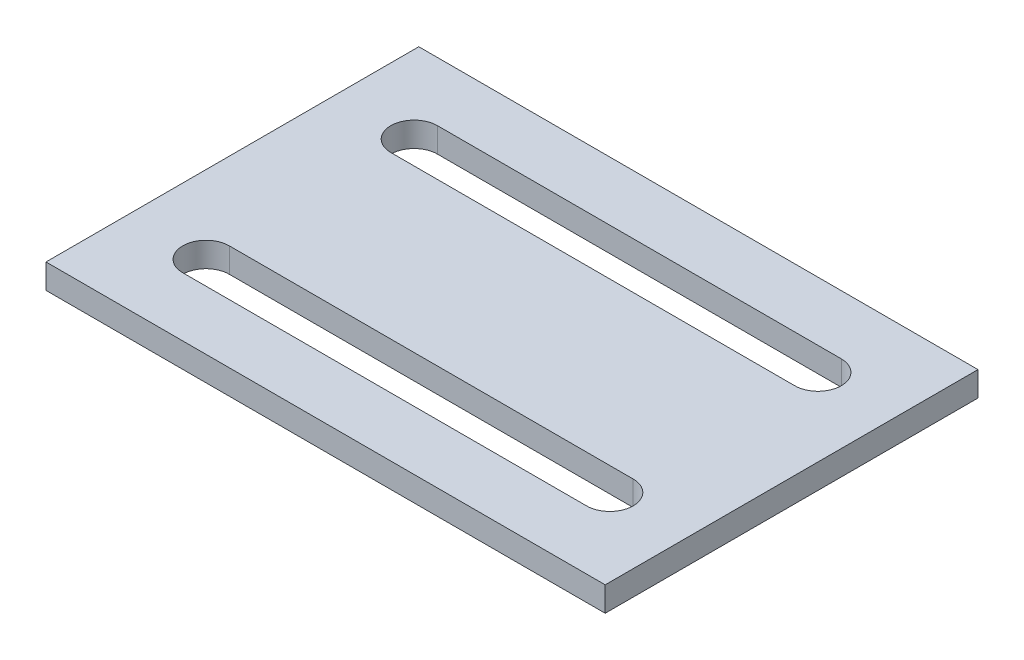
ISO-10303-21;
HEADER;
FILE_DESCRIPTION(('STEP AP214'),'2;1');
FILE_NAME('part.step','',(''),(''),'','','');
FILE_SCHEMA(('AUTOMOTIVE_DESIGN { 1 0 10303 214 1 1 1 1 }'));
ENDSEC;
DATA;
#1=APPLICATION_CONTEXT('core data for automotive mechanical design processes');
#2=APPLICATION_PROTOCOL_DEFINITION('international standard','automotive_design',2000,#1);
#3=PRODUCT_CONTEXT('',#1,'mechanical');
#4=PRODUCT('Part','Part','',(#3));
#5=PRODUCT_RELATED_PRODUCT_CATEGORY('part','',(#4));
#6=PRODUCT_DEFINITION_FORMATION('','',#4);
#7=PRODUCT_DEFINITION_CONTEXT('part definition',#1,'design');
#8=PRODUCT_DEFINITION('design','',#6,#7);
#9=PRODUCT_DEFINITION_SHAPE('','',#8);
#10=(LENGTH_UNIT() NAMED_UNIT(*) SI_UNIT(.MILLI.,.METRE.));
#11=(NAMED_UNIT(*) PLANE_ANGLE_UNIT() SI_UNIT($,.RADIAN.));
#12=(NAMED_UNIT(*) SI_UNIT($,.STERADIAN.) SOLID_ANGLE_UNIT());
#13=UNCERTAINTY_MEASURE_WITH_UNIT(LENGTH_MEASURE(1.E-05),#10,'distance_accuracy_value','');
#14=(GEOMETRIC_REPRESENTATION_CONTEXT(3) GLOBAL_UNCERTAINTY_ASSIGNED_CONTEXT((#13)) GLOBAL_UNIT_ASSIGNED_CONTEXT((#10,
#11,#12)) REPRESENTATION_CONTEXT('',''));
#15=CARTESIAN_POINT('',(0.,0.,0.));
#16=DIRECTION('',(0.,0.,1.));
#17=DIRECTION('',(1.,0.,0.));
#18=AXIS2_PLACEMENT_3D('',#15,#16,#17);
#19=CARTESIAN_POINT('',(0.,7.9375,0.));
#20=DIRECTION('',(0.,1.,0.));
#21=DIRECTION('',(0.,0.,1.));
#22=AXIS2_PLACEMENT_3D('',#19,#20,#21);
#23=PLANE('',#22);
#24=DIRECTION('',(0.,0.,1.));
#25=VECTOR('',#24,1.);
#26=CARTESIAN_POINT('',(-90.,7.9375,60.));
#27=LINE('',#26,#25);
#28=CARTESIAN_POINT('',(-90.,7.9375,-60.));
#29=VERTEX_POINT('',#28);
#30=CARTESIAN_POINT('',(-90.,7.9375,60.));
#31=VERTEX_POINT('',#30);
#32=EDGE_CURVE('E189',#29,#31,#27,.T.);
#33=ORIENTED_EDGE('',*,*,#32,.T.);
#34=DIRECTION('',(1.,0.,0.));
#35=VECTOR('',#34,1.);
#36=CARTESIAN_POINT('',(90.,7.9375,60.));
#37=LINE('',#36,#35);
#38=CARTESIAN_POINT('',(90.,7.9375,60.));
#39=VERTEX_POINT('',#38);
#40=EDGE_CURVE('E192',#31,#39,#37,.T.);
#41=ORIENTED_EDGE('',*,*,#40,.T.);
#42=DIRECTION('',(0.,0.,-1.));
#43=VECTOR('',#42,1.);
#44=CARTESIAN_POINT('',(90.,7.9375,60.));
#45=LINE('',#44,#43);
#46=CARTESIAN_POINT('',(90.,7.9375,-60.));
#47=VERTEX_POINT('',#46);
#48=EDGE_CURVE('E195',#39,#47,#45,.T.);
#49=ORIENTED_EDGE('',*,*,#48,.T.);
#50=DIRECTION('',(-1.,0.,0.));
#51=VECTOR('',#50,1.);
#52=CARTESIAN_POINT('',(90.,7.9375,-60.));
#53=LINE('',#52,#51);
#54=EDGE_CURVE('E197',#47,#29,#53,.T.);
#55=ORIENTED_EDGE('',*,*,#54,.T.);
#56=EDGE_LOOP('',(#33,#41,#49,#55));
#57=FACE_BOUND('',#56,.T.);
#58=DIRECTION('',(1.,0.,0.));
#59=VECTOR('',#58,1.);
#60=CARTESIAN_POINT('',(-65.,7.9375,41.));
#61=LINE('',#60,#59);
#62=CARTESIAN_POINT('',(-65.,7.9375,41.));
#63=VERTEX_POINT('',#62);
#64=CARTESIAN_POINT('',(65.,7.9375,41.));
#65=VERTEX_POINT('',#64);
#66=EDGE_CURVE('E160',#63,#65,#61,.T.);
#67=ORIENTED_EDGE('',*,*,#66,.F.);
#68=CARTESIAN_POINT('',(-65.,7.9375,33.5));
#69=DIRECTION('',(0.,1.,0.));
#70=DIRECTION('',(0.,0.,1.));
#71=AXIS2_PLACEMENT_3D('',#68,#69,#70);
#72=CIRCLE('',#71,7.5);
#73=CARTESIAN_POINT('',(-65.,7.9375,26.));
#74=VERTEX_POINT('',#73);
#75=EDGE_CURVE('E158',#74,#63,#72,.T.);
#76=ORIENTED_EDGE('',*,*,#75,.F.);
#77=DIRECTION('',(-1.,0.,0.));
#78=VECTOR('',#77,1.);
#79=CARTESIAN_POINT('',(-65.,7.9375,26.));
#80=LINE('',#79,#78);
#81=CARTESIAN_POINT('',(65.,7.9375,26.));
#82=VERTEX_POINT('',#81);
#83=EDGE_CURVE('E166',#82,#74,#80,.T.);
#84=ORIENTED_EDGE('',*,*,#83,.F.);
#85=CARTESIAN_POINT('',(65.,7.9375,33.5));
#86=DIRECTION('',(0.,1.,0.));
#87=DIRECTION('',(0.,0.,1.));
#88=AXIS2_PLACEMENT_3D('',#85,#86,#87);
#89=CIRCLE('',#88,7.5);
#90=EDGE_CURVE('E163',#65,#82,#89,.T.);
#91=ORIENTED_EDGE('',*,*,#90,.F.);
#92=EDGE_LOOP('',(#67,#76,#84,#91));
#93=FACE_BOUND('',#92,.T.);
#94=DIRECTION('',(1.,0.,0.));
#95=VECTOR('',#94,1.);
#96=CARTESIAN_POINT('',(-65.,7.9375,-26.));
#97=LINE('',#96,#95);
#98=CARTESIAN_POINT('',(-65.,7.9375,-26.));
#99=VERTEX_POINT('',#98);
#100=CARTESIAN_POINT('',(65.,7.9375,-26.));
#101=VERTEX_POINT('',#100);
#102=EDGE_CURVE('E130',#99,#101,#97,.T.);
#103=ORIENTED_EDGE('',*,*,#102,.F.);
#104=CARTESIAN_POINT('',(-65.,7.9375,-33.5));
#105=DIRECTION('',(0.,1.,0.));
#106=DIRECTION('',(0.,0.,1.));
#107=AXIS2_PLACEMENT_3D('',#104,#105,#106);
#108=CIRCLE('',#107,7.50000000000001);
#109=CARTESIAN_POINT('',(-65.,7.9375,-41.));
#110=VERTEX_POINT('',#109);
#111=EDGE_CURVE('E122',#110,#99,#108,.T.);
#112=ORIENTED_EDGE('',*,*,#111,.F.);
#113=DIRECTION('',(-1.,0.,0.));
#114=VECTOR('',#113,1.);
#115=CARTESIAN_POINT('',(-65.,7.9375,-41.));
#116=LINE('',#115,#114);
#117=CARTESIAN_POINT('',(65.,7.9375,-41.));
#118=VERTEX_POINT('',#117);
#119=EDGE_CURVE('E144',#118,#110,#116,.T.);
#120=ORIENTED_EDGE('',*,*,#119,.F.);
#121=CARTESIAN_POINT('',(65.,7.9375,-33.5));
#122=DIRECTION('',(0.,1.,0.));
#123=DIRECTION('',(0.,0.,1.));
#124=AXIS2_PLACEMENT_3D('',#121,#122,#123);
#125=CIRCLE('',#124,7.50000000000001);
#126=EDGE_CURVE('E142',#101,#118,#125,.T.);
#127=ORIENTED_EDGE('',*,*,#126,.F.);
#128=EDGE_LOOP('',(#103,#112,#120,#127));
#129=FACE_BOUND('',#128,.T.);
#130=ADVANCED_FACE('F33',(#57,#93,#129),#23,.T.);
#131=CARTESIAN_POINT('',(0.,0.,0.));
#132=DIRECTION('',(0.,1.,0.));
#133=DIRECTION('',(0.,0.,1.));
#134=AXIS2_PLACEMENT_3D('',#131,#132,#133);
#135=PLANE('',#134);
#136=CARTESIAN_POINT('',(-65.,0.,33.5));
#137=DIRECTION('',(0.,1.,0.));
#138=DIRECTION('',(0.,0.,1.));
#139=AXIS2_PLACEMENT_3D('',#136,#137,#138);
#140=CIRCLE('',#139,7.5);
#141=CARTESIAN_POINT('',(-65.,0.,26.));
#142=VERTEX_POINT('',#141);
#143=CARTESIAN_POINT('',(-65.,0.,41.));
#144=VERTEX_POINT('',#143);
#145=EDGE_CURVE('E138',#142,#144,#140,.T.);
#146=ORIENTED_EDGE('',*,*,#145,.T.);
#147=DIRECTION('',(1.,0.,0.));
#148=VECTOR('',#147,1.);
#149=CARTESIAN_POINT('',(-65.,0.,41.));
#150=LINE('',#149,#148);
#151=CARTESIAN_POINT('',(65.,0.,41.));
#152=VERTEX_POINT('',#151);
#153=EDGE_CURVE('E171',#144,#152,#150,.T.);
#154=ORIENTED_EDGE('',*,*,#153,.T.);
#155=CARTESIAN_POINT('',(65.,0.,33.5));
#156=DIRECTION('',(0.,1.,0.));
#157=DIRECTION('',(0.,0.,1.));
#158=AXIS2_PLACEMENT_3D('',#155,#156,#157);
#159=CIRCLE('',#158,7.5);
#160=CARTESIAN_POINT('',(65.,0.,26.));
#161=VERTEX_POINT('',#160);
#162=EDGE_CURVE('E174',#152,#161,#159,.T.);
#163=ORIENTED_EDGE('',*,*,#162,.T.);
#164=DIRECTION('',(-1.,0.,0.));
#165=VECTOR('',#164,1.);
#166=CARTESIAN_POINT('',(-65.,0.,26.));
#167=LINE('',#166,#165);
#168=EDGE_CURVE('E161',#161,#142,#167,.T.);
#169=ORIENTED_EDGE('',*,*,#168,.T.);
#170=EDGE_LOOP('',(#146,#154,#163,#169));
#171=FACE_BOUND('',#170,.T.);
#172=DIRECTION('',(0.,0.,1.));
#173=VECTOR('',#172,1.);
#174=CARTESIAN_POINT('',(-90.,0.,60.));
#175=LINE('',#174,#173);
#176=CARTESIAN_POINT('',(-90.,0.,-60.));
#177=VERTEX_POINT('',#176);
#178=CARTESIAN_POINT('',(-90.,0.,60.));
#179=VERTEX_POINT('',#178);
#180=EDGE_CURVE('E188',#177,#179,#175,.T.);
#181=ORIENTED_EDGE('',*,*,#180,.F.);
#182=DIRECTION('',(-1.,0.,0.));
#183=VECTOR('',#182,1.);
#184=CARTESIAN_POINT('',(90.,0.,-60.));
#185=LINE('',#184,#183);
#186=CARTESIAN_POINT('',(90.,0.,-60.));
#187=VERTEX_POINT('',#186);
#188=EDGE_CURVE('E193',#187,#177,#185,.T.);
#189=ORIENTED_EDGE('',*,*,#188,.F.);
#190=DIRECTION('',(0.,0.,-1.));
#191=VECTOR('',#190,1.);
#192=CARTESIAN_POINT('',(90.,0.,60.));
#193=LINE('',#192,#191);
#194=CARTESIAN_POINT('',(90.,0.,60.));
#195=VERTEX_POINT('',#194);
#196=EDGE_CURVE('E204',#195,#187,#193,.T.);
#197=ORIENTED_EDGE('',*,*,#196,.F.);
#198=DIRECTION('',(1.,0.,0.));
#199=VECTOR('',#198,1.);
#200=CARTESIAN_POINT('',(90.,0.,60.));
#201=LINE('',#200,#199);
#202=EDGE_CURVE('E202',#179,#195,#201,.T.);
#203=ORIENTED_EDGE('',*,*,#202,.F.);
#204=EDGE_LOOP('',(#181,#189,#197,#203));
#205=FACE_BOUND('',#204,.T.);
#206=CARTESIAN_POINT('',(-65.,0.,-33.5));
#207=DIRECTION('',(0.,1.,0.));
#208=DIRECTION('',(0.,0.,1.));
#209=AXIS2_PLACEMENT_3D('',#206,#207,#208);
#210=CIRCLE('',#209,7.50000000000001);
#211=CARTESIAN_POINT('',(-65.,0.,-41.));
#212=VERTEX_POINT('',#211);
#213=CARTESIAN_POINT('',(-65.,0.,-26.));
#214=VERTEX_POINT('',#213);
#215=EDGE_CURVE('E56',#212,#214,#210,.T.);
#216=ORIENTED_EDGE('',*,*,#215,.T.);
#217=DIRECTION('',(1.,0.,0.));
#218=VECTOR('',#217,1.);
#219=CARTESIAN_POINT('',(-65.,0.,-26.));
#220=LINE('',#219,#218);
#221=CARTESIAN_POINT('',(65.,0.,-26.));
#222=VERTEX_POINT('',#221);
#223=EDGE_CURVE('E137',#214,#222,#220,.T.);
#224=ORIENTED_EDGE('',*,*,#223,.T.);
#225=CARTESIAN_POINT('',(65.,0.,-33.5));
#226=DIRECTION('',(0.,1.,0.));
#227=DIRECTION('',(0.,0.,1.));
#228=AXIS2_PLACEMENT_3D('',#225,#226,#227);
#229=CIRCLE('',#228,7.50000000000001);
#230=CARTESIAN_POINT('',(65.,0.,-41.));
#231=VERTEX_POINT('',#230);
#232=EDGE_CURVE('E150',#222,#231,#229,.T.);
#233=ORIENTED_EDGE('',*,*,#232,.T.);
#234=DIRECTION('',(-1.,0.,0.));
#235=VECTOR('',#234,1.);
#236=CARTESIAN_POINT('',(-65.,0.,-41.));
#237=LINE('',#236,#235);
#238=EDGE_CURVE('E131',#231,#212,#237,.T.);
#239=ORIENTED_EDGE('',*,*,#238,.T.);
#240=EDGE_LOOP('',(#216,#224,#233,#239));
#241=FACE_BOUND('',#240,.T.);
#242=ADVANCED_FACE('F222',(#171,#205,#241),#135,.F.);
#243=CARTESIAN_POINT('',(-90.,7.9375,60.));
#244=DIRECTION('',(1.,0.,0.));
#245=DIRECTION('',(0.,0.,-1.));
#246=AXIS2_PLACEMENT_3D('',#243,#244,#245);
#247=PLANE('',#246);
#248=ORIENTED_EDGE('',*,*,#180,.T.);
#249=DIRECTION('',(0.,-1.,0.));
#250=VECTOR('',#249,1.);
#251=CARTESIAN_POINT('',(-90.,7.9375,60.));
#252=LINE('',#251,#250);
#253=EDGE_CURVE('E11',#31,#179,#252,.T.);
#254=ORIENTED_EDGE('',*,*,#253,.F.);
#255=ORIENTED_EDGE('',*,*,#32,.F.);
#256=DIRECTION('',(0.,-1.,0.));
#257=VECTOR('',#256,1.);
#258=CARTESIAN_POINT('',(-90.,7.9375,-60.));
#259=LINE('',#258,#257);
#260=EDGE_CURVE('E199',#29,#177,#259,.T.);
#261=ORIENTED_EDGE('',*,*,#260,.T.);
#262=EDGE_LOOP('',(#248,#254,#255,#261));
#263=FACE_BOUND('',#262,.T.);
#264=ADVANCED_FACE('F35',(#263),#247,.F.);
#265=CARTESIAN_POINT('',(90.,7.9375,60.));
#266=DIRECTION('',(0.,0.,-1.));
#267=DIRECTION('',(-1.,0.,0.));
#268=AXIS2_PLACEMENT_3D('',#265,#266,#267);
#269=PLANE('',#268);
#270=ORIENTED_EDGE('',*,*,#202,.T.);
#271=DIRECTION('',(0.,-1.,0.));
#272=VECTOR('',#271,1.);
#273=CARTESIAN_POINT('',(90.,7.9375,60.));
#274=LINE('',#273,#272);
#275=EDGE_CURVE('E41',#39,#195,#274,.T.);
#276=ORIENTED_EDGE('',*,*,#275,.F.);
#277=ORIENTED_EDGE('',*,*,#40,.F.);
#278=ORIENTED_EDGE('',*,*,#253,.T.);
#279=EDGE_LOOP('',(#270,#276,#277,#278));
#280=FACE_BOUND('',#279,.T.);
#281=ADVANCED_FACE('F233',(#280),#269,.F.);
#282=CARTESIAN_POINT('',(90.,7.9375,60.));
#283=DIRECTION('',(-1.,0.,0.));
#284=DIRECTION('',(0.,0.,1.));
#285=AXIS2_PLACEMENT_3D('',#282,#283,#284);
#286=PLANE('',#285);
#287=ORIENTED_EDGE('',*,*,#196,.T.);
#288=DIRECTION('',(0.,-1.,0.));
#289=VECTOR('',#288,1.);
#290=CARTESIAN_POINT('',(90.,7.9375,-60.));
#291=LINE('',#290,#289);
#292=EDGE_CURVE('E209',#47,#187,#291,.T.);
#293=ORIENTED_EDGE('',*,*,#292,.F.);
#294=ORIENTED_EDGE('',*,*,#48,.F.);
#295=ORIENTED_EDGE('',*,*,#275,.T.);
#296=EDGE_LOOP('',(#287,#293,#294,#295));
#297=FACE_BOUND('',#296,.T.);
#298=ADVANCED_FACE('F216',(#297),#286,.F.);
#299=CARTESIAN_POINT('',(90.,7.9375,-60.));
#300=DIRECTION('',(0.,0.,1.));
#301=DIRECTION('',(1.,0.,0.));
#302=AXIS2_PLACEMENT_3D('',#299,#300,#301);
#303=PLANE('',#302);
#304=ORIENTED_EDGE('',*,*,#188,.T.);
#305=ORIENTED_EDGE('',*,*,#260,.F.);
#306=ORIENTED_EDGE('',*,*,#54,.F.);
#307=ORIENTED_EDGE('',*,*,#292,.T.);
#308=EDGE_LOOP('',(#304,#305,#306,#307));
#309=FACE_BOUND('',#308,.T.);
#310=ADVANCED_FACE('F226',(#309),#303,.F.);
#311=CARTESIAN_POINT('',(-65.,7.9375,33.5));
#312=DIRECTION('',(0.,-1.,0.));
#313=DIRECTION('',(0.,0.,-1.));
#314=AXIS2_PLACEMENT_3D('',#311,#312,#313);
#315=CYLINDRICAL_SURFACE('',#314,7.5);
#316=ORIENTED_EDGE('',*,*,#145,.F.);
#317=DIRECTION('',(0.,-1.,0.));
#318=VECTOR('',#317,1.);
#319=CARTESIAN_POINT('',(-65.,7.9375,26.));
#320=LINE('',#319,#318);
#321=EDGE_CURVE('E168',#74,#142,#320,.T.);
#322=ORIENTED_EDGE('',*,*,#321,.F.);
#323=ORIENTED_EDGE('',*,*,#75,.T.);
#324=DIRECTION('',(0.,-1.,0.));
#325=VECTOR('',#324,1.);
#326=CARTESIAN_POINT('',(-65.,7.9375,41.));
#327=LINE('',#326,#325);
#328=EDGE_CURVE('E185',#63,#144,#327,.T.);
#329=ORIENTED_EDGE('',*,*,#328,.T.);
#330=EDGE_LOOP('',(#316,#322,#323,#329));
#331=FACE_BOUND('',#330,.T.);
#332=ADVANCED_FACE('F248',(#331),#315,.F.);
#333=CARTESIAN_POINT('',(-65.,7.9375,41.));
#334=DIRECTION('',(0.,0.,-1.));
#335=DIRECTION('',(-1.,0.,0.));
#336=AXIS2_PLACEMENT_3D('',#333,#334,#335);
#337=PLANE('',#336);
#338=ORIENTED_EDGE('',*,*,#153,.F.);
#339=ORIENTED_EDGE('',*,*,#328,.F.);
#340=ORIENTED_EDGE('',*,*,#66,.T.);
#341=DIRECTION('',(0.,-1.,0.));
#342=VECTOR('',#341,1.);
#343=CARTESIAN_POINT('',(65.,7.9375,41.));
#344=LINE('',#343,#342);
#345=EDGE_CURVE('E183',#65,#152,#344,.T.);
#346=ORIENTED_EDGE('',*,*,#345,.T.);
#347=EDGE_LOOP('',(#338,#339,#340,#346));
#348=FACE_BOUND('',#347,.T.);
#349=ADVANCED_FACE('F255',(#348),#337,.T.);
#350=CARTESIAN_POINT('',(65.,7.9375,33.5));
#351=DIRECTION('',(0.,-1.,0.));
#352=DIRECTION('',(0.,0.,-1.));
#353=AXIS2_PLACEMENT_3D('',#350,#351,#352);
#354=CYLINDRICAL_SURFACE('',#353,7.5);
#355=ORIENTED_EDGE('',*,*,#162,.F.);
#356=ORIENTED_EDGE('',*,*,#345,.F.);
#357=ORIENTED_EDGE('',*,*,#90,.T.);
#358=DIRECTION('',(0.,-1.,0.));
#359=VECTOR('',#358,1.);
#360=CARTESIAN_POINT('',(65.,7.9375,26.));
#361=LINE('',#360,#359);
#362=EDGE_CURVE('E181',#82,#161,#361,.T.);
#363=ORIENTED_EDGE('',*,*,#362,.T.);
#364=EDGE_LOOP('',(#355,#356,#357,#363));
#365=FACE_BOUND('',#364,.T.);
#366=ADVANCED_FACE('F260',(#365),#354,.F.);
#367=CARTESIAN_POINT('',(-65.,7.9375,26.));
#368=DIRECTION('',(0.,0.,1.));
#369=DIRECTION('',(1.,0.,0.));
#370=AXIS2_PLACEMENT_3D('',#367,#368,#369);
#371=PLANE('',#370);
#372=ORIENTED_EDGE('',*,*,#168,.F.);
#373=ORIENTED_EDGE('',*,*,#362,.F.);
#374=ORIENTED_EDGE('',*,*,#83,.T.);
#375=ORIENTED_EDGE('',*,*,#321,.T.);
#376=EDGE_LOOP('',(#372,#373,#374,#375));
#377=FACE_BOUND('',#376,.T.);
#378=ADVANCED_FACE('F267',(#377),#371,.T.);
#379=CARTESIAN_POINT('',(-65.,7.9375,-33.5));
#380=DIRECTION('',(0.,-1.,0.));
#381=DIRECTION('',(0.,0.,-1.));
#382=AXIS2_PLACEMENT_3D('',#379,#380,#381);
#383=CYLINDRICAL_SURFACE('',#382,7.50000000000001);
#384=ORIENTED_EDGE('',*,*,#215,.F.);
#385=DIRECTION('',(0.,-1.,0.));
#386=VECTOR('',#385,1.);
#387=CARTESIAN_POINT('',(-65.,7.9375,-41.));
#388=LINE('',#387,#386);
#389=EDGE_CURVE('E126',#110,#212,#388,.T.);
#390=ORIENTED_EDGE('',*,*,#389,.F.);
#391=ORIENTED_EDGE('',*,*,#111,.T.);
#392=DIRECTION('',(0.,-1.,0.));
#393=VECTOR('',#392,1.);
#394=CARTESIAN_POINT('',(-65.,7.9375,-26.));
#395=LINE('',#394,#393);
#396=EDGE_CURVE('E125',#99,#214,#395,.T.);
#397=ORIENTED_EDGE('',*,*,#396,.T.);
#398=EDGE_LOOP('',(#384,#390,#391,#397));
#399=FACE_BOUND('',#398,.T.);
#400=ADVANCED_FACE('F124',(#399),#383,.F.);
#401=CARTESIAN_POINT('',(-65.,7.9375,-26.));
#402=DIRECTION('',(0.,0.,-1.));
#403=DIRECTION('',(-1.,0.,0.));
#404=AXIS2_PLACEMENT_3D('',#401,#402,#403);
#405=PLANE('',#404);
#406=ORIENTED_EDGE('',*,*,#223,.F.);
#407=ORIENTED_EDGE('',*,*,#396,.F.);
#408=ORIENTED_EDGE('',*,*,#102,.T.);
#409=DIRECTION('',(0.,-1.,0.));
#410=VECTOR('',#409,1.);
#411=CARTESIAN_POINT('',(65.,7.9375,-26.));
#412=LINE('',#411,#410);
#413=EDGE_CURVE('E139',#101,#222,#412,.T.);
#414=ORIENTED_EDGE('',*,*,#413,.T.);
#415=EDGE_LOOP('',(#406,#407,#408,#414));
#416=FACE_BOUND('',#415,.T.);
#417=ADVANCED_FACE('F134',(#416),#405,.T.);
#418=CARTESIAN_POINT('',(65.,7.9375,-33.5));
#419=DIRECTION('',(0.,-1.,0.));
#420=DIRECTION('',(0.,0.,-1.));
#421=AXIS2_PLACEMENT_3D('',#418,#419,#420);
#422=CYLINDRICAL_SURFACE('',#421,7.50000000000001);
#423=ORIENTED_EDGE('',*,*,#232,.F.);
#424=ORIENTED_EDGE('',*,*,#413,.F.);
#425=ORIENTED_EDGE('',*,*,#126,.T.);
#426=DIRECTION('',(0.,-1.,0.));
#427=VECTOR('',#426,1.);
#428=CARTESIAN_POINT('',(65.,7.9375,-41.));
#429=LINE('',#428,#427);
#430=EDGE_CURVE('E48',#118,#231,#429,.T.);
#431=ORIENTED_EDGE('',*,*,#430,.T.);
#432=EDGE_LOOP('',(#423,#424,#425,#431));
#433=FACE_BOUND('',#432,.T.);
#434=ADVANCED_FACE('F285',(#433),#422,.F.);
#435=CARTESIAN_POINT('',(-65.,7.9375,-41.));
#436=DIRECTION('',(0.,0.,1.));
#437=DIRECTION('',(1.,0.,0.));
#438=AXIS2_PLACEMENT_3D('',#435,#436,#437);
#439=PLANE('',#438);
#440=ORIENTED_EDGE('',*,*,#238,.F.);
#441=ORIENTED_EDGE('',*,*,#430,.F.);
#442=ORIENTED_EDGE('',*,*,#119,.T.);
#443=ORIENTED_EDGE('',*,*,#389,.T.);
#444=EDGE_LOOP('',(#440,#441,#442,#443));
#445=FACE_BOUND('',#444,.T.);
#446=ADVANCED_FACE('F288',(#445),#439,.T.);
#447=CLOSED_SHELL('',(#130,#242,#264,#281,#298,#310,#332,#349,#366,#378,#400,#417,#434,#446));
#448=MANIFOLD_SOLID_BREP('B2',#447);
#449=ADVANCED_BREP_SHAPE_REPRESENTATION('',(#18,#448),#14);
#450=SHAPE_DEFINITION_REPRESENTATION(#9,#449);
ENDSEC;
END-ISO-10303-21;
